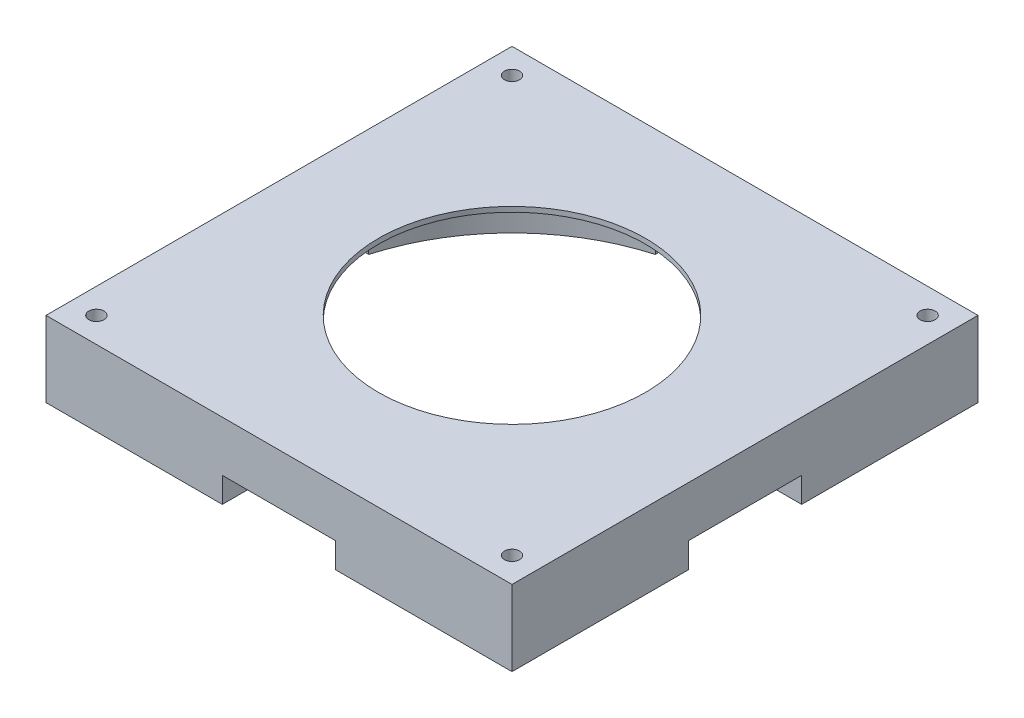
ISO-10303-21;
HEADER;
FILE_DESCRIPTION(('STEP AP214'),'2;1');
FILE_NAME('part.step','',(''),(''),'','','');
FILE_SCHEMA(('AUTOMOTIVE_DESIGN { 1 0 10303 214 1 1 1 1 }'));
ENDSEC;
DATA;
#1=APPLICATION_CONTEXT('core data for automotive mechanical design processes');
#2=APPLICATION_PROTOCOL_DEFINITION('international standard','automotive_design',2000,#1);
#3=PRODUCT_CONTEXT('',#1,'mechanical');
#4=PRODUCT('Part','Part','',(#3));
#5=PRODUCT_RELATED_PRODUCT_CATEGORY('part','',(#4));
#6=PRODUCT_DEFINITION_FORMATION('','',#4);
#7=PRODUCT_DEFINITION_CONTEXT('part definition',#1,'design');
#8=PRODUCT_DEFINITION('design','',#6,#7);
#9=PRODUCT_DEFINITION_SHAPE('','',#8);
#10=(LENGTH_UNIT() NAMED_UNIT(*) SI_UNIT(.MILLI.,.METRE.));
#11=(NAMED_UNIT(*) PLANE_ANGLE_UNIT() SI_UNIT($,.RADIAN.));
#12=(NAMED_UNIT(*) SI_UNIT($,.STERADIAN.) SOLID_ANGLE_UNIT());
#13=UNCERTAINTY_MEASURE_WITH_UNIT(LENGTH_MEASURE(1.E-05),#10,'distance_accuracy_value','');
#14=(GEOMETRIC_REPRESENTATION_CONTEXT(3) GLOBAL_UNCERTAINTY_ASSIGNED_CONTEXT((#13)) GLOBAL_UNIT_ASSIGNED_CONTEXT((#10,
#11,#12)) REPRESENTATION_CONTEXT('',''));
#15=CARTESIAN_POINT('',(0.,0.,0.));
#16=DIRECTION('',(0.,0.,1.));
#17=DIRECTION('',(1.,0.,0.));
#18=AXIS2_PLACEMENT_3D('',#15,#16,#17);
#19=CARTESIAN_POINT('',(82.5,-30.,0.));
#20=DIRECTION('',(0.,1.,0.));
#21=DIRECTION('',(0.,0.,1.));
#22=AXIS2_PLACEMENT_3D('',#19,#20,#21);
#23=PLANE('',#22);
#24=CARTESIAN_POINT('',(82.5,-30.,-82.5));
#25=DIRECTION('',(0.,-1.,0.));
#26=DIRECTION('',(0.,0.,-1.));
#27=AXIS2_PLACEMENT_3D('',#24,#25,#26);
#28=CIRCLE('',#27,3.00000000000001);
#29=CARTESIAN_POINT('',(82.5,-30.,-85.5));
#30=VERTEX_POINT('',#29);
#31=EDGE_CURVE('E275',#30,#30,#28,.T.);
#32=ORIENTED_EDGE('',*,*,#31,.F.);
#33=EDGE_LOOP('',(#32));
#34=FACE_BOUND('',#33,.T.);
#35=CARTESIAN_POINT('',(0.,-30.,0.));
#36=DIRECTION('',(0.,1.,0.));
#37=DIRECTION('',(0.,0.,1.));
#38=AXIS2_PLACEMENT_3D('',#35,#36,#37);
#39=CIRCLE('',#38,82.5);
#40=CARTESIAN_POINT('',(79.3725393319377,-30.,-22.5));
#41=VERTEX_POINT('',#40);
#42=CARTESIAN_POINT('',(22.5,-30.,-79.3725393319377));
#43=VERTEX_POINT('',#42);
#44=EDGE_CURVE('E295',#41,#43,#39,.T.);
#45=ORIENTED_EDGE('',*,*,#44,.T.);
#46=DIRECTION('',(0.,0.,-1.));
#47=VECTOR('',#46,1.);
#48=CARTESIAN_POINT('',(22.5,-30.,92.5));
#49=LINE('',#48,#47);
#50=CARTESIAN_POINT('',(22.5,-30.,-92.5));
#51=VERTEX_POINT('',#50);
#52=EDGE_CURVE('E200',#43,#51,#49,.T.);
#53=ORIENTED_EDGE('',*,*,#52,.T.);
#54=DIRECTION('',(1.,0.,0.));
#55=VECTOR('',#54,1.);
#56=CARTESIAN_POINT('',(-92.5,-30.,-92.5));
#57=LINE('',#56,#55);
#58=CARTESIAN_POINT('',(92.5,-30.,-92.5));
#59=VERTEX_POINT('',#58);
#60=EDGE_CURVE('E585',#51,#59,#57,.T.);
#61=ORIENTED_EDGE('',*,*,#60,.T.);
#62=DIRECTION('',(0.,0.,1.));
#63=VECTOR('',#62,1.);
#64=CARTESIAN_POINT('',(92.5,-30.,-92.5));
#65=LINE('',#64,#63);
#66=CARTESIAN_POINT('',(92.5,-30.,-22.5));
#67=VERTEX_POINT('',#66);
#68=EDGE_CURVE('E227',#59,#67,#65,.T.);
#69=ORIENTED_EDGE('',*,*,#68,.T.);
#70=DIRECTION('',(-1.,0.,0.));
#71=VECTOR('',#70,1.);
#72=CARTESIAN_POINT('',(92.5,-30.,-22.5));
#73=LINE('',#72,#71);
#74=EDGE_CURVE('E259',#67,#41,#73,.T.);
#75=ORIENTED_EDGE('',*,*,#74,.T.);
#76=EDGE_LOOP('',(#45,#53,#61,#69,#75));
#77=FACE_BOUND('',#76,.T.);
#78=ADVANCED_FACE('F48',(#34,#77),#23,.F.);
#79=CARTESIAN_POINT('',(82.5,-30.,82.5));
#80=DIRECTION('',(0.,-1.,0.));
#81=DIRECTION('',(0.,0.,-1.));
#82=AXIS2_PLACEMENT_3D('',#79,#80,#81);
#83=CIRCLE('',#82,3.00000000000001);
#84=CARTESIAN_POINT('',(82.5,-30.,79.5));
#85=VERTEX_POINT('',#84);
#86=EDGE_CURVE('E280',#85,#85,#83,.T.);
#87=ORIENTED_EDGE('',*,*,#86,.F.);
#88=EDGE_LOOP('',(#87));
#89=FACE_BOUND('',#88,.T.);
#90=DIRECTION('',(-1.,0.,0.));
#91=VECTOR('',#90,1.);
#92=CARTESIAN_POINT('',(-92.5,-30.,92.5));
#93=LINE('',#92,#91);
#94=CARTESIAN_POINT('',(92.5,-30.,92.5));
#95=VERTEX_POINT('',#94);
#96=CARTESIAN_POINT('',(22.5,-30.,92.5));
#97=VERTEX_POINT('',#96);
#98=EDGE_CURVE('E206',#95,#97,#93,.T.);
#99=ORIENTED_EDGE('',*,*,#98,.T.);
#100=CARTESIAN_POINT('',(22.5,-30.,79.3725393319377));
#101=VERTEX_POINT('',#100);
#102=EDGE_CURVE('E189',#97,#101,#49,.T.);
#103=ORIENTED_EDGE('',*,*,#102,.T.);
#104=CARTESIAN_POINT('',(79.3725393319377,-30.,22.5));
#105=VERTEX_POINT('',#104);
#106=EDGE_CURVE('E294',#101,#105,#39,.T.);
#107=ORIENTED_EDGE('',*,*,#106,.T.);
#108=DIRECTION('',(-1.,0.,0.));
#109=VECTOR('',#108,1.);
#110=CARTESIAN_POINT('',(92.5,-30.,22.5));
#111=LINE('',#110,#109);
#112=CARTESIAN_POINT('',(92.5,-30.,22.5));
#113=VERTEX_POINT('',#112);
#114=EDGE_CURVE('E248',#113,#105,#111,.T.);
#115=ORIENTED_EDGE('',*,*,#114,.F.);
#116=EDGE_CURVE('E215',#113,#95,#65,.T.);
#117=ORIENTED_EDGE('',*,*,#116,.T.);
#118=EDGE_LOOP('',(#99,#103,#107,#115,#117));
#119=FACE_BOUND('',#118,.T.);
#120=ADVANCED_FACE('F212',(#89,#119),#23,.F.);
#121=CARTESIAN_POINT('',(-82.5,-30.,-82.5));
#122=DIRECTION('',(0.,-1.,0.));
#123=DIRECTION('',(0.,0.,-1.));
#124=AXIS2_PLACEMENT_3D('',#121,#122,#123);
#125=CIRCLE('',#124,3.00000000000001);
#126=CARTESIAN_POINT('',(-82.5,-30.,-85.5));
#127=VERTEX_POINT('',#126);
#128=EDGE_CURVE('E270',#127,#127,#125,.T.);
#129=ORIENTED_EDGE('',*,*,#128,.F.);
#130=EDGE_LOOP('',(#129));
#131=FACE_BOUND('',#130,.T.);
#132=CARTESIAN_POINT('',(-92.5,-30.,-92.5));
#133=VERTEX_POINT('',#132);
#134=CARTESIAN_POINT('',(-22.5,-30.,-92.5));
#135=VERTEX_POINT('',#134);
#136=EDGE_CURVE('E581',#133,#135,#57,.T.);
#137=ORIENTED_EDGE('',*,*,#136,.T.);
#138=DIRECTION('',(0.,0.,-1.));
#139=VECTOR('',#138,1.);
#140=CARTESIAN_POINT('',(-22.5,-30.,92.5));
#141=LINE('',#140,#139);
#142=CARTESIAN_POINT('',(-22.5,-30.,-79.3725393319377));
#143=VERTEX_POINT('',#142);
#144=EDGE_CURVE('E73',#143,#135,#141,.T.);
#145=ORIENTED_EDGE('',*,*,#144,.F.);
#146=CARTESIAN_POINT('',(-79.3725393319377,-30.,-22.5));
#147=VERTEX_POINT('',#146);
#148=EDGE_CURVE('E293',#143,#147,#39,.T.);
#149=ORIENTED_EDGE('',*,*,#148,.T.);
#150=CARTESIAN_POINT('',(-92.5,-30.,-22.5));
#151=VERTEX_POINT('',#150);
#152=EDGE_CURVE('E442',#147,#151,#73,.T.);
#153=ORIENTED_EDGE('',*,*,#152,.T.);
#154=DIRECTION('',(0.,0.,-1.));
#155=VECTOR('',#154,1.);
#156=CARTESIAN_POINT('',(-92.5,-30.,-92.5));
#157=LINE('',#156,#155);
#158=EDGE_CURVE('E218',#151,#133,#157,.T.);
#159=ORIENTED_EDGE('',*,*,#158,.T.);
#160=EDGE_LOOP('',(#137,#145,#149,#153,#159));
#161=FACE_BOUND('',#160,.T.);
#162=ADVANCED_FACE('F392',(#131,#161),#23,.F.);
#163=CARTESIAN_POINT('',(0.,0.,0.));
#164=DIRECTION('',(0.,1.,0.));
#165=DIRECTION('',(0.,0.,1.));
#166=AXIS2_PLACEMENT_3D('',#163,#164,#165);
#167=CYLINDRICAL_SURFACE('',#166,53.);
#168=CARTESIAN_POINT('',(0.,-2.,0.));
#169=DIRECTION('',(0.,1.,0.));
#170=DIRECTION('',(0.,0.,1.));
#171=AXIS2_PLACEMENT_3D('',#168,#169,#170);
#172=CIRCLE('',#171,53.);
#173=CARTESIAN_POINT('',(0.,-2.,53.));
#174=VERTEX_POINT('',#173);
#175=EDGE_CURVE('E12',#174,#174,#172,.T.);
#176=ORIENTED_EDGE('',*,*,#175,.F.);
#177=EDGE_LOOP('',(#176));
#178=FACE_BOUND('',#177,.T.);
#179=CARTESIAN_POINT('',(0.,0.,0.));
#180=DIRECTION('',(0.,1.,0.));
#181=DIRECTION('',(0.,0.,1.));
#182=AXIS2_PLACEMENT_3D('',#179,#180,#181);
#183=CIRCLE('',#182,53.);
#184=CARTESIAN_POINT('',(0.,0.,53.));
#185=VERTEX_POINT('',#184);
#186=EDGE_CURVE('E296',#185,#185,#183,.T.);
#187=ORIENTED_EDGE('',*,*,#186,.T.);
#188=EDGE_LOOP('',(#187));
#189=FACE_BOUND('',#188,.T.);
#190=ADVANCED_FACE('F50',(#178,#189),#167,.F.);
#191=CARTESIAN_POINT('',(53.,-2.,0.));
#192=DIRECTION('',(0.,1.,0.));
#193=DIRECTION('',(0.,0.,1.));
#194=AXIS2_PLACEMENT_3D('',#191,#192,#193);
#195=PLANE('',#194);
#196=CARTESIAN_POINT('',(0.,-2.,0.));
#197=DIRECTION('',(0.,1.,0.));
#198=DIRECTION('',(0.,0.,1.));
#199=AXIS2_PLACEMENT_3D('',#196,#197,#198);
#200=CIRCLE('',#199,82.5);
#201=CARTESIAN_POINT('',(0.,-2.,82.5));
#202=VERTEX_POINT('',#201);
#203=EDGE_CURVE('E58',#202,#202,#200,.T.);
#204=ORIENTED_EDGE('',*,*,#203,.F.);
#205=EDGE_LOOP('',(#204));
#206=FACE_BOUND('',#205,.T.);
#207=ORIENTED_EDGE('',*,*,#175,.T.);
#208=EDGE_LOOP('',(#207));
#209=FACE_BOUND('',#208,.T.);
#210=ADVANCED_FACE('F409',(#206,#209),#195,.F.);
#211=CARTESIAN_POINT('',(0.,0.,0.));
#212=DIRECTION('',(0.,1.,0.));
#213=DIRECTION('',(0.,0.,1.));
#214=AXIS2_PLACEMENT_3D('',#211,#212,#213);
#215=CYLINDRICAL_SURFACE('',#214,82.5);
#216=ORIENTED_EDGE('',*,*,#106,.F.);
#217=DIRECTION('',(0.,1.,0.));
#218=VECTOR('',#217,1.);
#219=CARTESIAN_POINT('',(22.5,0.,79.3725393319377));
#220=LINE('',#219,#218);
#221=CARTESIAN_POINT('',(22.5,-20.,79.3725393319377));
#222=VERTEX_POINT('',#221);
#223=EDGE_CURVE('E195',#101,#222,#220,.T.);
#224=ORIENTED_EDGE('',*,*,#223,.T.);
#225=CARTESIAN_POINT('',(0.,-20.,0.));
#226=DIRECTION('',(0.,1.,0.));
#227=DIRECTION('',(-1.,0.,0.));
#228=AXIS2_PLACEMENT_3D('',#225,#226,#227);
#229=CIRCLE('',#228,82.5);
#230=CARTESIAN_POINT('',(-22.5,-20.,79.3725393319377));
#231=VERTEX_POINT('',#230);
#232=EDGE_CURVE('E544',#222,#231,#229,.F.);
#233=ORIENTED_EDGE('',*,*,#232,.T.);
#234=DIRECTION('',(0.,1.,0.));
#235=VECTOR('',#234,1.);
#236=CARTESIAN_POINT('',(-22.5,0.,79.3725393319377));
#237=LINE('',#236,#235);
#238=CARTESIAN_POINT('',(-22.5,-30.,79.3725393319377));
#239=VERTEX_POINT('',#238);
#240=EDGE_CURVE('E324',#231,#239,#237,.F.);
#241=ORIENTED_EDGE('',*,*,#240,.T.);
#242=CARTESIAN_POINT('',(-79.3725393319377,-30.,22.5));
#243=VERTEX_POINT('',#242);
#244=EDGE_CURVE('E288',#243,#239,#39,.T.);
#245=ORIENTED_EDGE('',*,*,#244,.F.);
#246=DIRECTION('',(0.,1.,0.));
#247=VECTOR('',#246,1.);
#248=CARTESIAN_POINT('',(-79.3725393319377,0.,22.5));
#249=LINE('',#248,#247);
#250=CARTESIAN_POINT('',(-79.3725393319377,-20.,22.5));
#251=VERTEX_POINT('',#250);
#252=EDGE_CURVE('E454',#243,#251,#249,.T.);
#253=ORIENTED_EDGE('',*,*,#252,.T.);
#254=CARTESIAN_POINT('',(0.,-20.,0.));
#255=DIRECTION('',(0.,1.,0.));
#256=DIRECTION('',(0.,0.,1.));
#257=AXIS2_PLACEMENT_3D('',#254,#255,#256);
#258=CIRCLE('',#257,82.5);
#259=CARTESIAN_POINT('',(-79.3725393319377,-20.,-22.5));
#260=VERTEX_POINT('',#259);
#261=EDGE_CURVE('E342',#251,#260,#258,.F.);
#262=ORIENTED_EDGE('',*,*,#261,.T.);
#263=DIRECTION('',(0.,1.,0.));
#264=VECTOR('',#263,1.);
#265=CARTESIAN_POINT('',(-79.3725393319377,0.,-22.5));
#266=LINE('',#265,#264);
#267=EDGE_CURVE('E341',#260,#147,#266,.F.);
#268=ORIENTED_EDGE('',*,*,#267,.T.);
#269=ORIENTED_EDGE('',*,*,#148,.F.);
#270=DIRECTION('',(0.,1.,0.));
#271=VECTOR('',#270,1.);
#272=CARTESIAN_POINT('',(-22.5,0.,-79.3725393319377));
#273=LINE('',#272,#271);
#274=CARTESIAN_POINT('',(-22.5,-20.,-79.3725393319377));
#275=VERTEX_POINT('',#274);
#276=EDGE_CURVE('E318',#143,#275,#273,.T.);
#277=ORIENTED_EDGE('',*,*,#276,.T.);
#278=CARTESIAN_POINT('',(22.5,-20.,-79.3725393319377));
#279=VERTEX_POINT('',#278);
#280=EDGE_CURVE('E548',#275,#279,#229,.F.);
#281=ORIENTED_EDGE('',*,*,#280,.T.);
#282=DIRECTION('',(0.,1.,0.));
#283=VECTOR('',#282,1.);
#284=CARTESIAN_POINT('',(22.5,0.,-79.3725393319377));
#285=LINE('',#284,#283);
#286=EDGE_CURVE('E520',#279,#43,#285,.F.);
#287=ORIENTED_EDGE('',*,*,#286,.T.);
#288=ORIENTED_EDGE('',*,*,#44,.F.);
#289=DIRECTION('',(0.,1.,0.));
#290=VECTOR('',#289,1.);
#291=CARTESIAN_POINT('',(79.3725393319377,0.,-22.5));
#292=LINE('',#291,#290);
#293=CARTESIAN_POINT('',(79.3725393319377,-20.,-22.5));
#294=VERTEX_POINT('',#293);
#295=EDGE_CURVE('E335',#41,#294,#292,.T.);
#296=ORIENTED_EDGE('',*,*,#295,.T.);
#297=CARTESIAN_POINT('',(79.3725393319377,-20.,22.5));
#298=VERTEX_POINT('',#297);
#299=EDGE_CURVE('E343',#294,#298,#258,.F.);
#300=ORIENTED_EDGE('',*,*,#299,.T.);
#301=DIRECTION('',(0.,1.,0.));
#302=VECTOR('',#301,1.);
#303=CARTESIAN_POINT('',(79.3725393319377,0.,22.5));
#304=LINE('',#303,#302);
#305=EDGE_CURVE('E462',#298,#105,#304,.F.);
#306=ORIENTED_EDGE('',*,*,#305,.T.);
#307=EDGE_LOOP('',(#216,#224,#233,#241,#245,#253,#262,#268,#269,#277,#281,#287,#288,#296,#300,#306));
#308=FACE_BOUND('',#307,.T.);
#309=ORIENTED_EDGE('',*,*,#203,.T.);
#310=EDGE_LOOP('',(#309));
#311=FACE_BOUND('',#310,.T.);
#312=ADVANCED_FACE('F405',(#308,#311),#215,.F.);
#313=ORIENTED_EDGE('',*,*,#244,.T.);
#314=CARTESIAN_POINT('',(-22.5,-30.,92.5));
#315=VERTEX_POINT('',#314);
#316=EDGE_CURVE('E307',#315,#239,#141,.T.);
#317=ORIENTED_EDGE('',*,*,#316,.F.);
#318=CARTESIAN_POINT('',(-92.5,-30.,92.5));
#319=VERTEX_POINT('',#318);
#320=EDGE_CURVE('E219',#315,#319,#93,.T.);
#321=ORIENTED_EDGE('',*,*,#320,.T.);
#322=CARTESIAN_POINT('',(-92.5,-30.,22.5));
#323=VERTEX_POINT('',#322);
#324=EDGE_CURVE('E224',#319,#323,#157,.T.);
#325=ORIENTED_EDGE('',*,*,#324,.T.);
#326=EDGE_CURVE('E255',#243,#323,#111,.T.);
#327=ORIENTED_EDGE('',*,*,#326,.F.);
#328=EDGE_LOOP('',(#313,#317,#321,#325,#327));
#329=FACE_BOUND('',#328,.T.);
#330=CARTESIAN_POINT('',(-82.5,-30.,82.5));
#331=DIRECTION('',(0.,-1.,0.));
#332=DIRECTION('',(0.,0.,-1.));
#333=AXIS2_PLACEMENT_3D('',#330,#331,#332);
#334=CIRCLE('',#333,3.00000000000001);
#335=CARTESIAN_POINT('',(-82.5,-30.,79.5));
#336=VERTEX_POINT('',#335);
#337=EDGE_CURVE('E348',#336,#336,#334,.T.);
#338=ORIENTED_EDGE('',*,*,#337,.F.);
#339=EDGE_LOOP('',(#338));
#340=FACE_BOUND('',#339,.T.);
#341=ADVANCED_FACE('F399',(#329,#340),#23,.F.);
#342=CARTESIAN_POINT('',(85.5,0.,0.));
#343=DIRECTION('',(0.,-1.,0.));
#344=DIRECTION('',(0.,0.,-1.));
#345=AXIS2_PLACEMENT_3D('',#342,#343,#344);
#346=PLANE('',#345);
#347=ORIENTED_EDGE('',*,*,#186,.F.);
#348=EDGE_LOOP('',(#347));
#349=FACE_BOUND('',#348,.T.);
#350=DIRECTION('',(0.,0.,-1.));
#351=VECTOR('',#350,1.);
#352=CARTESIAN_POINT('',(92.5,0.,-92.5));
#353=LINE('',#352,#351);
#354=CARTESIAN_POINT('',(92.5,0.,92.5));
#355=VERTEX_POINT('',#354);
#356=CARTESIAN_POINT('',(92.5,0.,-92.5));
#357=VERTEX_POINT('',#356);
#358=EDGE_CURVE('E365',#355,#357,#353,.T.);
#359=ORIENTED_EDGE('',*,*,#358,.T.);
#360=DIRECTION('',(-1.,0.,0.));
#361=VECTOR('',#360,1.);
#362=CARTESIAN_POINT('',(-92.5,0.,-92.5));
#363=LINE('',#362,#361);
#364=CARTESIAN_POINT('',(-92.5,0.,-92.5));
#365=VERTEX_POINT('',#364);
#366=EDGE_CURVE('E369',#357,#365,#363,.T.);
#367=ORIENTED_EDGE('',*,*,#366,.T.);
#368=DIRECTION('',(0.,0.,1.));
#369=VECTOR('',#368,1.);
#370=CARTESIAN_POINT('',(-92.5,0.,-92.5));
#371=LINE('',#370,#369);
#372=CARTESIAN_POINT('',(-92.5,0.,92.5));
#373=VERTEX_POINT('',#372);
#374=EDGE_CURVE('E366',#365,#373,#371,.T.);
#375=ORIENTED_EDGE('',*,*,#374,.T.);
#376=DIRECTION('',(1.,0.,0.));
#377=VECTOR('',#376,1.);
#378=CARTESIAN_POINT('',(-92.5,0.,92.5));
#379=LINE('',#378,#377);
#380=EDGE_CURVE('E362',#373,#355,#379,.T.);
#381=ORIENTED_EDGE('',*,*,#380,.T.);
#382=EDGE_LOOP('',(#359,#367,#375,#381));
#383=FACE_BOUND('',#382,.T.);
#384=CARTESIAN_POINT('',(-82.5,0.,-82.5));
#385=DIRECTION('',(0.,-1.,0.));
#386=DIRECTION('',(0.,0.,-1.));
#387=AXIS2_PLACEMENT_3D('',#384,#385,#386);
#388=CIRCLE('',#387,3.00000000000001);
#389=CARTESIAN_POINT('',(-82.5,0.,-85.5));
#390=VERTEX_POINT('',#389);
#391=EDGE_CURVE('E354',#390,#390,#388,.F.);
#392=ORIENTED_EDGE('',*,*,#391,.F.);
#393=EDGE_LOOP('',(#392));
#394=FACE_BOUND('',#393,.T.);
#395=CARTESIAN_POINT('',(82.5,0.,82.5));
#396=DIRECTION('',(0.,-1.,0.));
#397=DIRECTION('',(0.,0.,-1.));
#398=AXIS2_PLACEMENT_3D('',#395,#396,#397);
#399=CIRCLE('',#398,3.00000000000001);
#400=CARTESIAN_POINT('',(82.5,0.,79.5));
#401=VERTEX_POINT('',#400);
#402=EDGE_CURVE('E349',#401,#401,#399,.F.);
#403=ORIENTED_EDGE('',*,*,#402,.F.);
#404=EDGE_LOOP('',(#403));
#405=FACE_BOUND('',#404,.T.);
#406=CARTESIAN_POINT('',(-82.5,0.,82.5));
#407=DIRECTION('',(0.,-1.,0.));
#408=DIRECTION('',(0.,0.,-1.));
#409=AXIS2_PLACEMENT_3D('',#406,#407,#408);
#410=CIRCLE('',#409,3.00000000000001);
#411=CARTESIAN_POINT('',(-82.5,0.,79.5));
#412=VERTEX_POINT('',#411);
#413=EDGE_CURVE('E353',#412,#412,#410,.F.);
#414=ORIENTED_EDGE('',*,*,#413,.F.);
#415=EDGE_LOOP('',(#414));
#416=FACE_BOUND('',#415,.T.);
#417=CARTESIAN_POINT('',(82.5,0.,-82.5));
#418=DIRECTION('',(0.,-1.,0.));
#419=DIRECTION('',(0.,0.,-1.));
#420=AXIS2_PLACEMENT_3D('',#417,#418,#419);
#421=CIRCLE('',#420,3.00000000000001);
#422=CARTESIAN_POINT('',(82.5,0.,-85.5));
#423=VERTEX_POINT('',#422);
#424=EDGE_CURVE('E355',#423,#423,#421,.F.);
#425=ORIENTED_EDGE('',*,*,#424,.F.);
#426=EDGE_LOOP('',(#425));
#427=FACE_BOUND('',#426,.T.);
#428=ADVANCED_FACE('F404',(#349,#383,#394,#405,#416,#427),#346,.F.);
#429=CARTESIAN_POINT('',(-92.5,261.629509039023,92.5));
#430=DIRECTION('',(0.,0.,1.));
#431=DIRECTION('',(1.,0.,0.));
#432=AXIS2_PLACEMENT_3D('',#429,#430,#431);
#433=PLANE('',#432);
#434=DIRECTION('',(0.,-1.,0.));
#435=VECTOR('',#434,1.);
#436=CARTESIAN_POINT('',(22.5,-30.,92.5));
#437=LINE('',#436,#435);
#438=CARTESIAN_POINT('',(22.5,-20.,92.5));
#439=VERTEX_POINT('',#438);
#440=EDGE_CURVE('E193',#439,#97,#437,.T.);
#441=ORIENTED_EDGE('',*,*,#440,.T.);
#442=ORIENTED_EDGE('',*,*,#98,.F.);
#443=DIRECTION('',(0.,-1.,0.));
#444=VECTOR('',#443,1.);
#445=CARTESIAN_POINT('',(92.5,261.629509039023,92.5));
#446=LINE('',#445,#444);
#447=EDGE_CURVE('E584',#355,#95,#446,.T.);
#448=ORIENTED_EDGE('',*,*,#447,.F.);
#449=ORIENTED_EDGE('',*,*,#380,.F.);
#450=DIRECTION('',(0.,-1.,0.));
#451=VECTOR('',#450,1.);
#452=CARTESIAN_POINT('',(-92.5,261.629509039023,92.5));
#453=LINE('',#452,#451);
#454=EDGE_CURVE('E588',#373,#319,#453,.T.);
#455=ORIENTED_EDGE('',*,*,#454,.T.);
#456=ORIENTED_EDGE('',*,*,#320,.F.);
#457=DIRECTION('',(0.,1.,0.));
#458=VECTOR('',#457,1.);
#459=CARTESIAN_POINT('',(-22.5,-30.,92.5));
#460=LINE('',#459,#458);
#461=CARTESIAN_POINT('',(-22.5,-20.,92.5));
#462=VERTEX_POINT('',#461);
#463=EDGE_CURVE('E209',#315,#462,#460,.T.);
#464=ORIENTED_EDGE('',*,*,#463,.T.);
#465=DIRECTION('',(1.,0.,0.));
#466=VECTOR('',#465,1.);
#467=CARTESIAN_POINT('',(22.5,-20.,92.5));
#468=LINE('',#467,#466);
#469=EDGE_CURVE('E65',#462,#439,#468,.T.);
#470=ORIENTED_EDGE('',*,*,#469,.T.);
#471=EDGE_LOOP('',(#441,#442,#448,#449,#455,#456,#464,#470));
#472=FACE_BOUND('',#471,.T.);
#473=ADVANCED_FACE('F204',(#472),#433,.T.);
#474=CARTESIAN_POINT('',(-92.5,261.629509039023,-92.5));
#475=DIRECTION('',(-1.,0.,0.));
#476=DIRECTION('',(0.,0.,1.));
#477=AXIS2_PLACEMENT_3D('',#474,#475,#476);
#478=PLANE('',#477);
#479=DIRECTION('',(0.,-1.,0.));
#480=VECTOR('',#479,1.);
#481=CARTESIAN_POINT('',(-92.5,-30.,-22.5));
#482=LINE('',#481,#480);
#483=CARTESIAN_POINT('',(-92.5,-20.,-22.5));
#484=VERTEX_POINT('',#483);
#485=EDGE_CURVE('E448',#484,#151,#482,.T.);
#486=ORIENTED_EDGE('',*,*,#485,.F.);
#487=DIRECTION('',(0.,0.,-1.));
#488=VECTOR('',#487,1.);
#489=CARTESIAN_POINT('',(-92.5,-20.,-22.5));
#490=LINE('',#489,#488);
#491=CARTESIAN_POINT('',(-92.5,-20.,22.5));
#492=VERTEX_POINT('',#491);
#493=EDGE_CURVE('E480',#492,#484,#490,.T.);
#494=ORIENTED_EDGE('',*,*,#493,.F.);
#495=DIRECTION('',(0.,1.,0.));
#496=VECTOR('',#495,1.);
#497=CARTESIAN_POINT('',(-92.5,-30.,22.5));
#498=LINE('',#497,#496);
#499=EDGE_CURVE('E519',#323,#492,#498,.T.);
#500=ORIENTED_EDGE('',*,*,#499,.F.);
#501=ORIENTED_EDGE('',*,*,#324,.F.);
#502=ORIENTED_EDGE('',*,*,#454,.F.);
#503=ORIENTED_EDGE('',*,*,#374,.F.);
#504=DIRECTION('',(0.,-1.,0.));
#505=VECTOR('',#504,1.);
#506=CARTESIAN_POINT('',(-92.5,261.629509039023,-92.5));
#507=LINE('',#506,#505);
#508=EDGE_CURVE('E579',#365,#133,#507,.T.);
#509=ORIENTED_EDGE('',*,*,#508,.T.);
#510=ORIENTED_EDGE('',*,*,#158,.F.);
#511=EDGE_LOOP('',(#486,#494,#500,#501,#502,#503,#509,#510));
#512=FACE_BOUND('',#511,.T.);
#513=ADVANCED_FACE('F575',(#512),#478,.T.);
#514=CARTESIAN_POINT('',(-92.5,261.629509039023,-92.5));
#515=DIRECTION('',(0.,0.,-1.));
#516=DIRECTION('',(-1.,0.,0.));
#517=AXIS2_PLACEMENT_3D('',#514,#515,#516);
#518=PLANE('',#517);
#519=DIRECTION('',(0.,-1.,0.));
#520=VECTOR('',#519,1.);
#521=CARTESIAN_POINT('',(22.5,-30.,-92.5));
#522=LINE('',#521,#520);
#523=CARTESIAN_POINT('',(22.5,-20.,-92.5));
#524=VERTEX_POINT('',#523);
#525=EDGE_CURVE('E526',#524,#51,#522,.T.);
#526=ORIENTED_EDGE('',*,*,#525,.F.);
#527=DIRECTION('',(1.,0.,0.));
#528=VECTOR('',#527,1.);
#529=CARTESIAN_POINT('',(22.5,-20.,-92.5));
#530=LINE('',#529,#528);
#531=CARTESIAN_POINT('',(-22.5,-20.,-92.5));
#532=VERTEX_POINT('',#531);
#533=EDGE_CURVE('E210',#532,#524,#530,.T.);
#534=ORIENTED_EDGE('',*,*,#533,.F.);
#535=DIRECTION('',(0.,1.,0.));
#536=VECTOR('',#535,1.);
#537=CARTESIAN_POINT('',(-22.5,-30.,-92.5));
#538=LINE('',#537,#536);
#539=EDGE_CURVE('E501',#135,#532,#538,.T.);
#540=ORIENTED_EDGE('',*,*,#539,.F.);
#541=ORIENTED_EDGE('',*,*,#136,.F.);
#542=ORIENTED_EDGE('',*,*,#508,.F.);
#543=ORIENTED_EDGE('',*,*,#366,.F.);
#544=DIRECTION('',(0.,-1.,0.));
#545=VECTOR('',#544,1.);
#546=CARTESIAN_POINT('',(92.5,261.629509039023,-92.5));
#547=LINE('',#546,#545);
#548=EDGE_CURVE('E370',#357,#59,#547,.T.);
#549=ORIENTED_EDGE('',*,*,#548,.T.);
#550=ORIENTED_EDGE('',*,*,#60,.F.);
#551=EDGE_LOOP('',(#526,#534,#540,#541,#542,#543,#549,#550));
#552=FACE_BOUND('',#551,.T.);
#553=ADVANCED_FACE('F635',(#552),#518,.T.);
#554=CARTESIAN_POINT('',(92.5,261.629509039023,-92.5));
#555=DIRECTION('',(1.,0.,0.));
#556=DIRECTION('',(0.,0.,-1.));
#557=AXIS2_PLACEMENT_3D('',#554,#555,#556);
#558=PLANE('',#557);
#559=DIRECTION('',(0.,-1.,0.));
#560=VECTOR('',#559,1.);
#561=CARTESIAN_POINT('',(92.5,-30.,-22.5));
#562=LINE('',#561,#560);
#563=CARTESIAN_POINT('',(92.5,-20.,-22.5));
#564=VERTEX_POINT('',#563);
#565=EDGE_CURVE('E556',#564,#67,#562,.T.);
#566=ORIENTED_EDGE('',*,*,#565,.T.);
#567=ORIENTED_EDGE('',*,*,#68,.F.);
#568=ORIENTED_EDGE('',*,*,#548,.F.);
#569=ORIENTED_EDGE('',*,*,#358,.F.);
#570=ORIENTED_EDGE('',*,*,#447,.T.);
#571=ORIENTED_EDGE('',*,*,#116,.F.);
#572=DIRECTION('',(0.,1.,0.));
#573=VECTOR('',#572,1.);
#574=CARTESIAN_POINT('',(92.5,-30.,22.5));
#575=LINE('',#574,#573);
#576=CARTESIAN_POINT('',(92.5,-20.,22.5));
#577=VERTEX_POINT('',#576);
#578=EDGE_CURVE('E514',#113,#577,#575,.T.);
#579=ORIENTED_EDGE('',*,*,#578,.T.);
#580=DIRECTION('',(0.,0.,-1.));
#581=VECTOR('',#580,1.);
#582=CARTESIAN_POINT('',(92.5,-20.,-22.5));
#583=LINE('',#582,#581);
#584=EDGE_CURVE('E449',#577,#564,#583,.T.);
#585=ORIENTED_EDGE('',*,*,#584,.T.);
#586=EDGE_LOOP('',(#566,#567,#568,#569,#570,#571,#579,#585));
#587=FACE_BOUND('',#586,.T.);
#588=ADVANCED_FACE('F704',(#587),#558,.T.);
#589=CARTESIAN_POINT('',(-82.5,261.629509039023,-82.5));
#590=DIRECTION('',(0.,-1.,0.));
#591=DIRECTION('',(0.,0.,-1.));
#592=AXIS2_PLACEMENT_3D('',#589,#590,#591);
#593=CYLINDRICAL_SURFACE('',#592,3.00000000000001);
#594=ORIENTED_EDGE('',*,*,#391,.T.);
#595=EDGE_LOOP('',(#594));
#596=FACE_BOUND('',#595,.T.);
#597=ORIENTED_EDGE('',*,*,#128,.T.);
#598=EDGE_LOOP('',(#597));
#599=FACE_BOUND('',#598,.T.);
#600=ADVANCED_FACE('F614',(#596,#599),#593,.F.);
#601=CARTESIAN_POINT('',(82.5,261.629509039023,-82.5));
#602=DIRECTION('',(0.,-1.,0.));
#603=DIRECTION('',(0.,0.,-1.));
#604=AXIS2_PLACEMENT_3D('',#601,#602,#603);
#605=CYLINDRICAL_SURFACE('',#604,3.00000000000001);
#606=ORIENTED_EDGE('',*,*,#424,.T.);
#607=EDGE_LOOP('',(#606));
#608=FACE_BOUND('',#607,.T.);
#609=ORIENTED_EDGE('',*,*,#31,.T.);
#610=EDGE_LOOP('',(#609));
#611=FACE_BOUND('',#610,.T.);
#612=ADVANCED_FACE('F611',(#608,#611),#605,.F.);
#613=CARTESIAN_POINT('',(82.5,261.629509039023,82.5));
#614=DIRECTION('',(0.,-1.,0.));
#615=DIRECTION('',(0.,0.,-1.));
#616=AXIS2_PLACEMENT_3D('',#613,#614,#615);
#617=CYLINDRICAL_SURFACE('',#616,3.00000000000001);
#618=ORIENTED_EDGE('',*,*,#402,.T.);
#619=EDGE_LOOP('',(#618));
#620=FACE_BOUND('',#619,.T.);
#621=ORIENTED_EDGE('',*,*,#86,.T.);
#622=EDGE_LOOP('',(#621));
#623=FACE_BOUND('',#622,.T.);
#624=ADVANCED_FACE('F387',(#620,#623),#617,.F.);
#625=CARTESIAN_POINT('',(-82.5,261.629509039023,82.5));
#626=DIRECTION('',(0.,-1.,0.));
#627=DIRECTION('',(0.,0.,-1.));
#628=AXIS2_PLACEMENT_3D('',#625,#626,#627);
#629=CYLINDRICAL_SURFACE('',#628,3.00000000000001);
#630=ORIENTED_EDGE('',*,*,#413,.T.);
#631=EDGE_LOOP('',(#630));
#632=FACE_BOUND('',#631,.T.);
#633=ORIENTED_EDGE('',*,*,#337,.T.);
#634=EDGE_LOOP('',(#633));
#635=FACE_BOUND('',#634,.T.);
#636=ADVANCED_FACE('F605',(#632,#635),#629,.F.);
#637=CARTESIAN_POINT('',(92.5,-30.,22.5));
#638=DIRECTION('',(0.,0.,1.));
#639=DIRECTION('',(1.,0.,0.));
#640=AXIS2_PLACEMENT_3D('',#637,#638,#639);
#641=PLANE('',#640);
#642=DIRECTION('',(-1.,0.,0.));
#643=VECTOR('',#642,1.);
#644=CARTESIAN_POINT('',(92.5,-20.,22.5));
#645=LINE('',#644,#643);
#646=EDGE_CURVE('E256',#577,#298,#645,.T.);
#647=ORIENTED_EDGE('',*,*,#646,.F.);
#648=ORIENTED_EDGE('',*,*,#578,.F.);
#649=ORIENTED_EDGE('',*,*,#114,.T.);
#650=ORIENTED_EDGE('',*,*,#305,.F.);
#651=EDGE_LOOP('',(#647,#648,#649,#650));
#652=FACE_BOUND('',#651,.T.);
#653=ADVANCED_FACE('F703',(#652),#641,.F.);
#654=CARTESIAN_POINT('',(92.5,-20.,-22.5));
#655=DIRECTION('',(0.,1.,0.));
#656=DIRECTION('',(0.,0.,1.));
#657=AXIS2_PLACEMENT_3D('',#654,#655,#656);
#658=PLANE('',#657);
#659=DIRECTION('',(-1.,0.,0.));
#660=VECTOR('',#659,1.);
#661=CARTESIAN_POINT('',(92.5,-20.,-22.5));
#662=LINE('',#661,#660);
#663=EDGE_CURVE('E467',#564,#294,#662,.T.);
#664=ORIENTED_EDGE('',*,*,#663,.F.);
#665=ORIENTED_EDGE('',*,*,#584,.F.);
#666=ORIENTED_EDGE('',*,*,#646,.T.);
#667=ORIENTED_EDGE('',*,*,#299,.F.);
#668=EDGE_LOOP('',(#664,#665,#666,#667));
#669=FACE_BOUND('',#668,.T.);
#670=ADVANCED_FACE('F701',(#669),#658,.F.);
#671=CARTESIAN_POINT('',(92.5,-30.,-22.5));
#672=DIRECTION('',(0.,0.,-1.));
#673=DIRECTION('',(-1.,0.,0.));
#674=AXIS2_PLACEMENT_3D('',#671,#672,#673);
#675=PLANE('',#674);
#676=ORIENTED_EDGE('',*,*,#74,.F.);
#677=ORIENTED_EDGE('',*,*,#565,.F.);
#678=ORIENTED_EDGE('',*,*,#663,.T.);
#679=ORIENTED_EDGE('',*,*,#295,.F.);
#680=EDGE_LOOP('',(#676,#677,#678,#679));
#681=FACE_BOUND('',#680,.T.);
#682=ADVANCED_FACE('F766',(#681),#675,.F.);
#683=EDGE_CURVE('E472',#260,#484,#662,.T.);
#684=ORIENTED_EDGE('',*,*,#683,.T.);
#685=ORIENTED_EDGE('',*,*,#485,.T.);
#686=ORIENTED_EDGE('',*,*,#152,.F.);
#687=ORIENTED_EDGE('',*,*,#267,.F.);
#688=EDGE_LOOP('',(#684,#685,#686,#687));
#689=FACE_BOUND('',#688,.T.);
#690=ADVANCED_FACE('F445',(#689),#675,.F.);
#691=EDGE_CURVE('E254',#251,#492,#645,.T.);
#692=ORIENTED_EDGE('',*,*,#691,.T.);
#693=ORIENTED_EDGE('',*,*,#493,.T.);
#694=ORIENTED_EDGE('',*,*,#683,.F.);
#695=ORIENTED_EDGE('',*,*,#261,.F.);
#696=EDGE_LOOP('',(#692,#693,#694,#695));
#697=FACE_BOUND('',#696,.T.);
#698=ADVANCED_FACE('F768',(#697),#658,.F.);
#699=ORIENTED_EDGE('',*,*,#326,.T.);
#700=ORIENTED_EDGE('',*,*,#499,.T.);
#701=ORIENTED_EDGE('',*,*,#691,.F.);
#702=ORIENTED_EDGE('',*,*,#252,.F.);
#703=EDGE_LOOP('',(#699,#700,#701,#702));
#704=FACE_BOUND('',#703,.T.);
#705=ADVANCED_FACE('F572',(#704),#641,.F.);
#706=CARTESIAN_POINT('',(-22.5,-30.,92.5));
#707=DIRECTION('',(-1.,0.,0.));
#708=DIRECTION('',(0.,0.,1.));
#709=AXIS2_PLACEMENT_3D('',#706,#707,#708);
#710=PLANE('',#709);
#711=ORIENTED_EDGE('',*,*,#144,.T.);
#712=ORIENTED_EDGE('',*,*,#539,.T.);
#713=DIRECTION('',(0.,0.,-1.));
#714=VECTOR('',#713,1.);
#715=CARTESIAN_POINT('',(-22.5,-20.,92.5));
#716=LINE('',#715,#714);
#717=EDGE_CURVE('E311',#275,#532,#716,.T.);
#718=ORIENTED_EDGE('',*,*,#717,.F.);
#719=ORIENTED_EDGE('',*,*,#276,.F.);
#720=EDGE_LOOP('',(#711,#712,#718,#719));
#721=FACE_BOUND('',#720,.T.);
#722=ADVANCED_FACE('F633',(#721),#710,.F.);
#723=CARTESIAN_POINT('',(22.5,-20.,92.5));
#724=DIRECTION('',(0.,1.,0.));
#725=DIRECTION('',(-1.,0.,0.));
#726=AXIS2_PLACEMENT_3D('',#723,#724,#725);
#727=PLANE('',#726);
#728=ORIENTED_EDGE('',*,*,#717,.T.);
#729=ORIENTED_EDGE('',*,*,#533,.T.);
#730=DIRECTION('',(0.,0.,-1.));
#731=VECTOR('',#730,1.);
#732=CARTESIAN_POINT('',(22.5,-20.,92.5));
#733=LINE('',#732,#731);
#734=EDGE_CURVE('E494',#279,#524,#733,.T.);
#735=ORIENTED_EDGE('',*,*,#734,.F.);
#736=ORIENTED_EDGE('',*,*,#280,.F.);
#737=EDGE_LOOP('',(#728,#729,#735,#736));
#738=FACE_BOUND('',#737,.T.);
#739=ADVANCED_FACE('F626',(#738),#727,.F.);
#740=CARTESIAN_POINT('',(22.5,-30.,92.5));
#741=DIRECTION('',(1.,0.,0.));
#742=DIRECTION('',(0.,0.,-1.));
#743=AXIS2_PLACEMENT_3D('',#740,#741,#742);
#744=PLANE('',#743);
#745=ORIENTED_EDGE('',*,*,#734,.T.);
#746=ORIENTED_EDGE('',*,*,#525,.T.);
#747=ORIENTED_EDGE('',*,*,#52,.F.);
#748=ORIENTED_EDGE('',*,*,#286,.F.);
#749=EDGE_LOOP('',(#745,#746,#747,#748));
#750=FACE_BOUND('',#749,.T.);
#751=ADVANCED_FACE('F624',(#750),#744,.F.);
#752=ORIENTED_EDGE('',*,*,#102,.F.);
#753=ORIENTED_EDGE('',*,*,#440,.F.);
#754=EDGE_CURVE('E325',#439,#222,#733,.T.);
#755=ORIENTED_EDGE('',*,*,#754,.T.);
#756=ORIENTED_EDGE('',*,*,#223,.F.);
#757=EDGE_LOOP('',(#752,#753,#755,#756));
#758=FACE_BOUND('',#757,.T.);
#759=ADVANCED_FACE('F191',(#758),#744,.F.);
#760=ORIENTED_EDGE('',*,*,#754,.F.);
#761=ORIENTED_EDGE('',*,*,#469,.F.);
#762=EDGE_CURVE('E312',#462,#231,#716,.T.);
#763=ORIENTED_EDGE('',*,*,#762,.T.);
#764=ORIENTED_EDGE('',*,*,#232,.F.);
#765=EDGE_LOOP('',(#760,#761,#763,#764));
#766=FACE_BOUND('',#765,.T.);
#767=ADVANCED_FACE('F807',(#766),#727,.F.);
#768=ORIENTED_EDGE('',*,*,#762,.F.);
#769=ORIENTED_EDGE('',*,*,#463,.F.);
#770=ORIENTED_EDGE('',*,*,#316,.T.);
#771=ORIENTED_EDGE('',*,*,#240,.F.);
#772=EDGE_LOOP('',(#768,#769,#770,#771));
#773=FACE_BOUND('',#772,.T.);
#774=ADVANCED_FACE('F538',(#773),#710,.F.);
#775=CLOSED_SHELL('',(#78,#120,#162,#190,#210,#312,#341,#428,#473,#513,#553,#588,#600,#612,#624,
#636,#653,#670,#682,#690,#698,#705,#722,#739,#751,#759,#767,#774));
#776=MANIFOLD_SOLID_BREP('B2',#775);
#777=ADVANCED_BREP_SHAPE_REPRESENTATION('',(#18,#776),#14);
#778=SHAPE_DEFINITION_REPRESENTATION(#9,#777);
ENDSEC;
END-ISO-10303-21;
